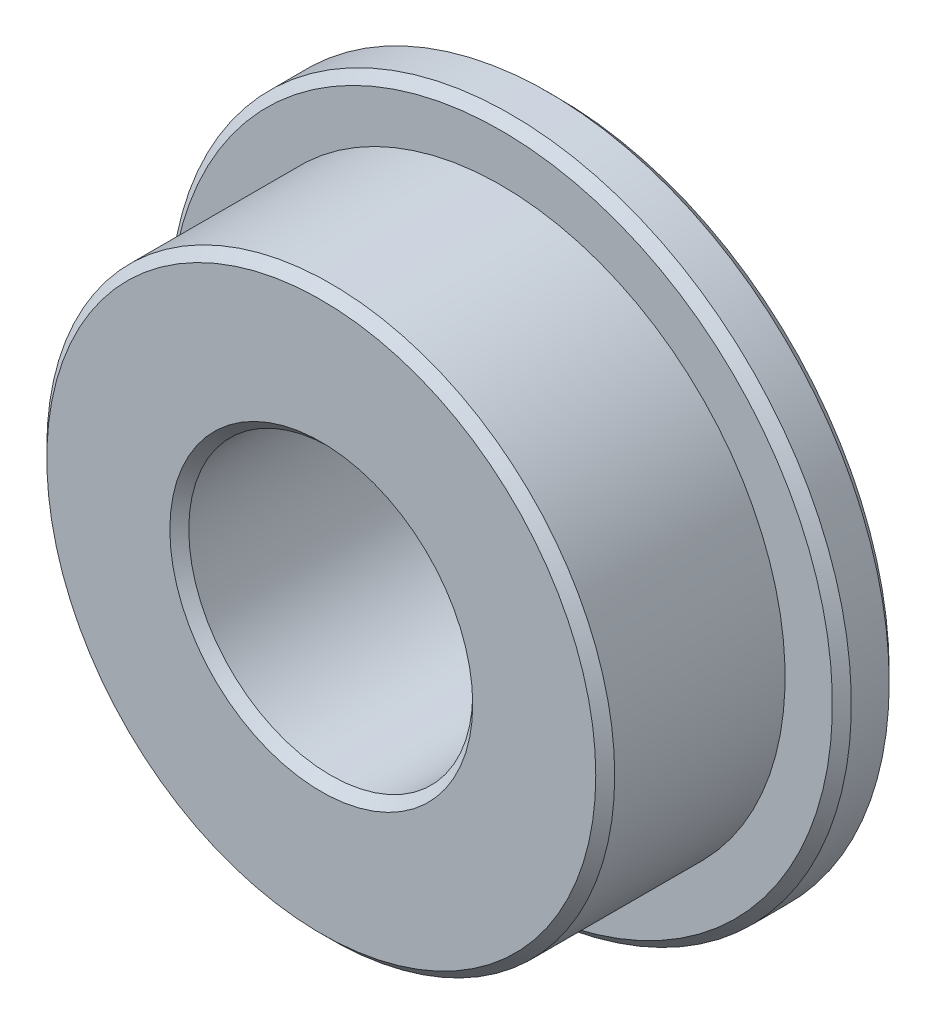
ISO-10303-21;
HEADER;
FILE_DESCRIPTION(('STEP AP214'),'2;1');
FILE_NAME('part.step','',(''),(''),'','','');
FILE_SCHEMA(('AUTOMOTIVE_DESIGN { 1 0 10303 214 1 1 1 1 }'));
ENDSEC;
DATA;
#1=APPLICATION_CONTEXT('core data for automotive mechanical design processes');
#2=APPLICATION_PROTOCOL_DEFINITION('international standard','automotive_design',2000,#1);
#3=PRODUCT_CONTEXT('',#1,'mechanical');
#4=PRODUCT('Part','Part','',(#3));
#5=PRODUCT_RELATED_PRODUCT_CATEGORY('part','',(#4));
#6=PRODUCT_DEFINITION_FORMATION('','',#4);
#7=PRODUCT_DEFINITION_CONTEXT('part definition',#1,'design');
#8=PRODUCT_DEFINITION('design','',#6,#7);
#9=PRODUCT_DEFINITION_SHAPE('','',#8);
#10=(LENGTH_UNIT() NAMED_UNIT(*) SI_UNIT(.MILLI.,.METRE.));
#11=(NAMED_UNIT(*) PLANE_ANGLE_UNIT() SI_UNIT($,.RADIAN.));
#12=(NAMED_UNIT(*) SI_UNIT($,.STERADIAN.) SOLID_ANGLE_UNIT());
#13=UNCERTAINTY_MEASURE_WITH_UNIT(LENGTH_MEASURE(1.E-05),#10,'distance_accuracy_value','');
#14=(GEOMETRIC_REPRESENTATION_CONTEXT(3) GLOBAL_UNCERTAINTY_ASSIGNED_CONTEXT((#13)) GLOBAL_UNIT_ASSIGNED_CONTEXT((#10,
#11,#12)) REPRESENTATION_CONTEXT('',''));
#15=CARTESIAN_POINT('',(0.,0.,0.));
#16=DIRECTION('',(0.,0.,1.));
#17=DIRECTION('',(1.,0.,0.));
#18=AXIS2_PLACEMENT_3D('',#15,#16,#17);
#19=CARTESIAN_POINT('',(0.,0.,1.25));
#20=DIRECTION('',(0.,0.,-1.));
#21=DIRECTION('',(-1.,0.,0.));
#22=AXIS2_PLACEMENT_3D('',#19,#20,#21);
#23=CYLINDRICAL_SURFACE('',#22,3.);
#24=CARTESIAN_POINT('',(0.,0.,1.15));
#25=DIRECTION('',(0.,0.,1.));
#26=DIRECTION('',(1.,0.,0.));
#27=AXIS2_PLACEMENT_3D('',#24,#25,#26);
#28=CIRCLE('',#27,3.);
#29=CARTESIAN_POINT('',(3.,0.,1.15));
#30=VERTEX_POINT('',#29);
#31=EDGE_CURVE('E49',#30,#30,#28,.F.);
#32=ORIENTED_EDGE('',*,*,#31,.T.);
#33=EDGE_LOOP('',(#32));
#34=FACE_BOUND('',#33,.T.);
#35=CARTESIAN_POINT('',(0.,0.,-0.65));
#36=DIRECTION('',(0.,0.,-1.));
#37=DIRECTION('',(-1.,0.,0.));
#38=AXIS2_PLACEMENT_3D('',#35,#36,#37);
#39=CIRCLE('',#38,3.);
#40=CARTESIAN_POINT('',(-3.,0.,-0.65));
#41=VERTEX_POINT('',#40);
#42=EDGE_CURVE('E72',#41,#41,#39,.T.);
#43=ORIENTED_EDGE('',*,*,#42,.F.);
#44=EDGE_LOOP('',(#43));
#45=FACE_BOUND('',#44,.T.);
#46=ADVANCED_FACE('F33',(#34,#45),#23,.T.);
#47=CARTESIAN_POINT('',(0.,0.,1.25));
#48=DIRECTION('',(0.,0.,1.));
#49=DIRECTION('',(1.,0.,0.));
#50=AXIS2_PLACEMENT_3D('',#47,#48,#49);
#51=PLANE('',#50);
#52=CARTESIAN_POINT('',(0.,0.,1.25));
#53=DIRECTION('',(0.,0.,1.));
#54=DIRECTION('',(1.,0.,0.));
#55=AXIS2_PLACEMENT_3D('',#52,#53,#54);
#56=CIRCLE('',#55,1.6);
#57=CARTESIAN_POINT('',(1.6,0.,1.25));
#58=VERTEX_POINT('',#57);
#59=EDGE_CURVE('E54',#58,#58,#56,.F.);
#60=ORIENTED_EDGE('',*,*,#59,.T.);
#61=EDGE_LOOP('',(#60));
#62=FACE_BOUND('',#61,.T.);
#63=CARTESIAN_POINT('',(0.,0.,1.25));
#64=DIRECTION('',(0.,0.,1.));
#65=DIRECTION('',(1.,0.,0.));
#66=AXIS2_PLACEMENT_3D('',#63,#64,#65);
#67=CIRCLE('',#66,2.9);
#68=CARTESIAN_POINT('',(2.9,0.,1.25));
#69=VERTEX_POINT('',#68);
#70=EDGE_CURVE('E57',#69,#69,#67,.T.);
#71=ORIENTED_EDGE('',*,*,#70,.T.);
#72=EDGE_LOOP('',(#71));
#73=FACE_BOUND('',#72,.T.);
#74=ADVANCED_FACE('F79',(#62,#73),#51,.T.);
#75=CARTESIAN_POINT('',(0.,0.,-1.25));
#76=DIRECTION('',(0.,0.,1.));
#77=DIRECTION('',(1.,0.,0.));
#78=AXIS2_PLACEMENT_3D('',#75,#76,#77);
#79=PLANE('',#78);
#80=CARTESIAN_POINT('',(0.,0.,-1.25));
#81=DIRECTION('',(0.,0.,1.));
#82=DIRECTION('',(1.,0.,0.));
#83=AXIS2_PLACEMENT_3D('',#80,#81,#82);
#84=CIRCLE('',#83,1.6);
#85=CARTESIAN_POINT('',(1.6,0.,-1.25));
#86=VERTEX_POINT('',#85);
#87=EDGE_CURVE('E66',#86,#86,#84,.T.);
#88=ORIENTED_EDGE('',*,*,#87,.T.);
#89=EDGE_LOOP('',(#88));
#90=FACE_BOUND('',#89,.T.);
#91=CARTESIAN_POINT('',(0.,0.,-1.25));
#92=DIRECTION('',(0.,0.,1.));
#93=DIRECTION('',(1.,0.,0.));
#94=AXIS2_PLACEMENT_3D('',#91,#92,#93);
#95=CIRCLE('',#94,3.5);
#96=CARTESIAN_POINT('',(3.5,0.,-1.25));
#97=VERTEX_POINT('',#96);
#98=EDGE_CURVE('E69',#97,#97,#95,.F.);
#99=ORIENTED_EDGE('',*,*,#98,.T.);
#100=EDGE_LOOP('',(#99));
#101=FACE_BOUND('',#100,.T.);
#102=ADVANCED_FACE('F85',(#90,#101),#79,.F.);
#103=CARTESIAN_POINT('',(0.,0.,1.25));
#104=DIRECTION('',(0.,0.,-1.));
#105=DIRECTION('',(-1.,0.,0.));
#106=AXIS2_PLACEMENT_3D('',#103,#104,#105);
#107=CYLINDRICAL_SURFACE('',#106,1.5);
#108=CARTESIAN_POINT('',(0.,0.,-1.15));
#109=DIRECTION('',(0.,0.,1.));
#110=DIRECTION('',(1.,0.,0.));
#111=AXIS2_PLACEMENT_3D('',#108,#109,#110);
#112=CIRCLE('',#111,1.5);
#113=CARTESIAN_POINT('',(1.5,0.,-1.15));
#114=VERTEX_POINT('',#113);
#115=EDGE_CURVE('E60',#114,#114,#112,.F.);
#116=ORIENTED_EDGE('',*,*,#115,.T.);
#117=EDGE_LOOP('',(#116));
#118=FACE_BOUND('',#117,.T.);
#119=CARTESIAN_POINT('',(0.,0.,1.15));
#120=DIRECTION('',(0.,0.,1.));
#121=DIRECTION('',(1.,0.,0.));
#122=AXIS2_PLACEMENT_3D('',#119,#120,#121);
#123=CIRCLE('',#122,1.5);
#124=CARTESIAN_POINT('',(1.5,0.,1.15));
#125=VERTEX_POINT('',#124);
#126=EDGE_CURVE('E63',#125,#125,#123,.T.);
#127=ORIENTED_EDGE('',*,*,#126,.T.);
#128=EDGE_LOOP('',(#127));
#129=FACE_BOUND('',#128,.T.);
#130=ADVANCED_FACE('F124',(#118,#129),#107,.F.);
#131=CARTESIAN_POINT('',(0.,0.,-0.65));
#132=DIRECTION('',(0.,0.,-1.));
#133=DIRECTION('',(-1.,0.,0.));
#134=AXIS2_PLACEMENT_3D('',#131,#132,#133);
#135=CYLINDRICAL_SURFACE('',#134,3.6);
#136=CARTESIAN_POINT('',(0.,0.,-1.15));
#137=DIRECTION('',(0.,0.,1.));
#138=DIRECTION('',(1.,0.,0.));
#139=AXIS2_PLACEMENT_3D('',#136,#137,#138);
#140=CIRCLE('',#139,3.6);
#141=CARTESIAN_POINT('',(3.6,0.,-1.15));
#142=VERTEX_POINT('',#141);
#143=EDGE_CURVE('E41',#142,#142,#140,.T.);
#144=ORIENTED_EDGE('',*,*,#143,.T.);
#145=EDGE_LOOP('',(#144));
#146=FACE_BOUND('',#145,.T.);
#147=CARTESIAN_POINT('',(0.,0.,-0.75));
#148=DIRECTION('',(0.,0.,-1.));
#149=DIRECTION('',(-1.,0.,0.));
#150=AXIS2_PLACEMENT_3D('',#147,#148,#149);
#151=CIRCLE('',#150,3.6);
#152=CARTESIAN_POINT('',(-3.6,0.,-0.75));
#153=VERTEX_POINT('',#152);
#154=EDGE_CURVE('E45',#153,#153,#151,.T.);
#155=ORIENTED_EDGE('',*,*,#154,.T.);
#156=EDGE_LOOP('',(#155));
#157=FACE_BOUND('',#156,.T.);
#158=ADVANCED_FACE('F129',(#146,#157),#135,.T.);
#159=CARTESIAN_POINT('',(0.,0.,-0.65));
#160=DIRECTION('',(0.,0.,-1.));
#161=DIRECTION('',(-1.,0.,0.));
#162=AXIS2_PLACEMENT_3D('',#159,#160,#161);
#163=PLANE('',#162);
#164=CARTESIAN_POINT('',(0.,0.,-0.65));
#165=DIRECTION('',(0.,0.,-1.));
#166=DIRECTION('',(-1.,0.,0.));
#167=AXIS2_PLACEMENT_3D('',#164,#165,#166);
#168=CIRCLE('',#167,3.5);
#169=CARTESIAN_POINT('',(-3.5,0.,-0.65));
#170=VERTEX_POINT('',#169);
#171=EDGE_CURVE('E10',#170,#170,#168,.F.);
#172=ORIENTED_EDGE('',*,*,#171,.T.);
#173=EDGE_LOOP('',(#172));
#174=FACE_BOUND('',#173,.T.);
#175=ORIENTED_EDGE('',*,*,#42,.T.);
#176=EDGE_LOOP('',(#175));
#177=FACE_BOUND('',#176,.T.);
#178=ADVANCED_FACE('F76',(#174,#177),#163,.F.);
#179=CARTESIAN_POINT('',(0.,0.,-1.25));
#180=DIRECTION('',(0.,0.,-1.));
#181=DIRECTION('',(-1.,0.,0.));
#182=AXIS2_PLACEMENT_3D('',#179,#180,#181);
#183=CONICAL_SURFACE('',#182,1.6,0.78539816339745);
#184=ORIENTED_EDGE('',*,*,#115,.F.);
#185=EDGE_LOOP('',(#184));
#186=FACE_BOUND('',#185,.T.);
#187=ORIENTED_EDGE('',*,*,#87,.F.);
#188=EDGE_LOOP('',(#187));
#189=FACE_BOUND('',#188,.T.);
#190=ADVANCED_FACE('F91',(#186,#189),#183,.F.);
#191=CARTESIAN_POINT('',(0.,0.,1.15));
#192=DIRECTION('',(0.,0.,1.));
#193=DIRECTION('',(1.,0.,0.));
#194=AXIS2_PLACEMENT_3D('',#191,#192,#193);
#195=CONICAL_SURFACE('',#194,1.5,0.785398163397443);
#196=ORIENTED_EDGE('',*,*,#59,.F.);
#197=EDGE_LOOP('',(#196));
#198=FACE_BOUND('',#197,.T.);
#199=ORIENTED_EDGE('',*,*,#126,.F.);
#200=EDGE_LOOP('',(#199));
#201=FACE_BOUND('',#200,.T.);
#202=ADVANCED_FACE('F97',(#198,#201),#195,.F.);
#203=CARTESIAN_POINT('',(0.,0.,1.25));
#204=DIRECTION('',(0.,0.,-1.));
#205=DIRECTION('',(-1.,0.,0.));
#206=AXIS2_PLACEMENT_3D('',#203,#204,#205);
#207=CONICAL_SURFACE('',#206,2.9,0.785398163397448);
#208=ORIENTED_EDGE('',*,*,#31,.F.);
#209=EDGE_LOOP('',(#208));
#210=FACE_BOUND('',#209,.T.);
#211=ORIENTED_EDGE('',*,*,#70,.F.);
#212=EDGE_LOOP('',(#211));
#213=FACE_BOUND('',#212,.T.);
#214=ADVANCED_FACE('F104',(#210,#213),#207,.T.);
#215=CARTESIAN_POINT('',(0.,0.,-1.25));
#216=DIRECTION('',(0.,0.,1.));
#217=DIRECTION('',(1.,0.,0.));
#218=AXIS2_PLACEMENT_3D('',#215,#216,#217);
#219=CONICAL_SURFACE('',#218,3.5,0.78539816339744);
#220=ORIENTED_EDGE('',*,*,#143,.F.);
#221=EDGE_LOOP('',(#220));
#222=FACE_BOUND('',#221,.T.);
#223=ORIENTED_EDGE('',*,*,#98,.F.);
#224=EDGE_LOOP('',(#223));
#225=FACE_BOUND('',#224,.T.);
#226=ADVANCED_FACE('F110',(#222,#225),#219,.T.);
#227=CARTESIAN_POINT('',(0.,0.,-0.75));
#228=DIRECTION('',(0.,0.,-1.));
#229=DIRECTION('',(-1.,0.,0.));
#230=AXIS2_PLACEMENT_3D('',#227,#228,#229);
#231=CONICAL_SURFACE('',#230,3.6,0.785398163397453);
#232=ORIENTED_EDGE('',*,*,#171,.F.);
#233=EDGE_LOOP('',(#232));
#234=FACE_BOUND('',#233,.T.);
#235=ORIENTED_EDGE('',*,*,#154,.F.);
#236=EDGE_LOOP('',(#235));
#237=FACE_BOUND('',#236,.T.);
#238=ADVANCED_FACE('F36',(#234,#237),#231,.T.);
#239=CLOSED_SHELL('',(#46,#74,#102,#130,#158,#178,#190,#202,#214,#226,#238));
#240=MANIFOLD_SOLID_BREP('B2',#239);
#241=ADVANCED_BREP_SHAPE_REPRESENTATION('',(#18,#240),#14);
#242=SHAPE_DEFINITION_REPRESENTATION(#9,#241);
ENDSEC;
END-ISO-10303-21;
